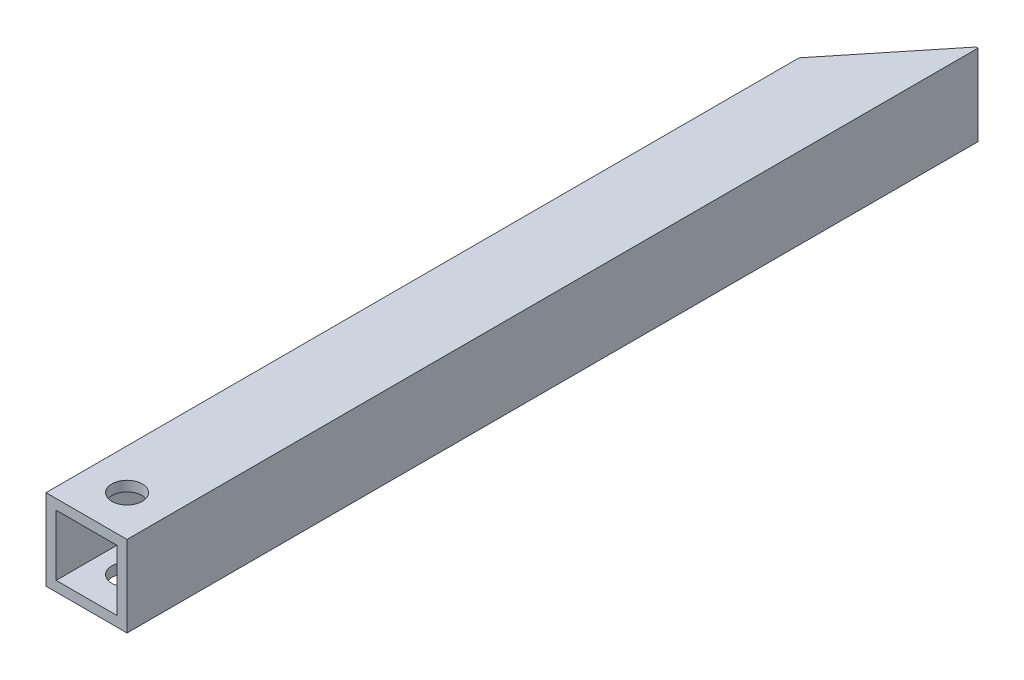
ISO-10303-21;
HEADER;
FILE_DESCRIPTION(('STEP AP214'),'2;1');
FILE_NAME('part.step','',(''),(''),'','','');
FILE_SCHEMA(('AUTOMOTIVE_DESIGN { 1 0 10303 214 1 1 1 1 }'));
ENDSEC;
DATA;
#1=APPLICATION_CONTEXT('core data for automotive mechanical design processes');
#2=APPLICATION_PROTOCOL_DEFINITION('international standard','automotive_design',2000,#1);
#3=PRODUCT_CONTEXT('',#1,'mechanical');
#4=PRODUCT('Part','Part','',(#3));
#5=PRODUCT_RELATED_PRODUCT_CATEGORY('part','',(#4));
#6=PRODUCT_DEFINITION_FORMATION('','',#4);
#7=PRODUCT_DEFINITION_CONTEXT('part definition',#1,'design');
#8=PRODUCT_DEFINITION('design','',#6,#7);
#9=PRODUCT_DEFINITION_SHAPE('','',#8);
#10=(LENGTH_UNIT() NAMED_UNIT(*) SI_UNIT(.MILLI.,.METRE.));
#11=(NAMED_UNIT(*) PLANE_ANGLE_UNIT() SI_UNIT($,.RADIAN.));
#12=(NAMED_UNIT(*) SI_UNIT($,.STERADIAN.) SOLID_ANGLE_UNIT());
#13=UNCERTAINTY_MEASURE_WITH_UNIT(LENGTH_MEASURE(1.E-05),#10,'distance_accuracy_value','');
#14=(GEOMETRIC_REPRESENTATION_CONTEXT(3) GLOBAL_UNCERTAINTY_ASSIGNED_CONTEXT((#13)) GLOBAL_UNIT_ASSIGNED_CONTEXT((#10,
#11,#12)) REPRESENTATION_CONTEXT('',''));
#15=CARTESIAN_POINT('',(0.,0.,0.));
#16=DIRECTION('',(0.,0.,1.));
#17=DIRECTION('',(1.,0.,0.));
#18=AXIS2_PLACEMENT_3D('',#15,#16,#17);
#19=CARTESIAN_POINT('',(0.,0.,266.7));
#20=DIRECTION('',(0.,0.,-1.));
#21=DIRECTION('',(-1.,0.,0.));
#22=AXIS2_PLACEMENT_3D('',#19,#20,#21);
#23=PLANE('',#22);
#24=DIRECTION('',(0.,-1.,0.));
#25=VECTOR('',#24,1.);
#26=CARTESIAN_POINT('',(0.,0.,266.7));
#27=LINE('',#26,#25);
#28=CARTESIAN_POINT('',(0.,25.4,266.7));
#29=VERTEX_POINT('',#28);
#30=CARTESIAN_POINT('',(0.,0.,266.7));
#31=VERTEX_POINT('',#30);
#32=EDGE_CURVE('E154',#29,#31,#27,.T.);
#33=ORIENTED_EDGE('',*,*,#32,.T.);
#34=DIRECTION('',(1.,0.,0.));
#35=VECTOR('',#34,1.);
#36=CARTESIAN_POINT('',(0.,0.,266.7));
#37=LINE('',#36,#35);
#38=CARTESIAN_POINT('',(25.4,0.,266.7));
#39=VERTEX_POINT('',#38);
#40=EDGE_CURVE('E161',#31,#39,#37,.T.);
#41=ORIENTED_EDGE('',*,*,#40,.T.);
#42=DIRECTION('',(0.,1.,0.));
#43=VECTOR('',#42,1.);
#44=CARTESIAN_POINT('',(25.4,0.,266.7));
#45=LINE('',#44,#43);
#46=CARTESIAN_POINT('',(25.4,25.4,266.7));
#47=VERTEX_POINT('',#46);
#48=EDGE_CURVE('E223',#39,#47,#45,.T.);
#49=ORIENTED_EDGE('',*,*,#48,.T.);
#50=DIRECTION('',(-1.,0.,0.));
#51=VECTOR('',#50,1.);
#52=CARTESIAN_POINT('',(0.,25.4,266.7));
#53=LINE('',#52,#51);
#54=EDGE_CURVE('E170',#47,#29,#53,.T.);
#55=ORIENTED_EDGE('',*,*,#54,.T.);
#56=EDGE_LOOP('',(#33,#41,#49,#55));
#57=FACE_BOUND('',#56,.T.);
#58=DIRECTION('',(0.,-1.,0.));
#59=VECTOR('',#58,1.);
#60=CARTESIAN_POINT('',(3.175,3.175,266.7));
#61=LINE('',#60,#59);
#62=CARTESIAN_POINT('',(3.175,22.225,266.7));
#63=VERTEX_POINT('',#62);
#64=CARTESIAN_POINT('',(3.175,3.175,266.7));
#65=VERTEX_POINT('',#64);
#66=EDGE_CURVE('E146',#63,#65,#61,.T.);
#67=ORIENTED_EDGE('',*,*,#66,.F.);
#68=DIRECTION('',(-1.,0.,0.));
#69=VECTOR('',#68,1.);
#70=CARTESIAN_POINT('',(3.175,22.225,266.7));
#71=LINE('',#70,#69);
#72=CARTESIAN_POINT('',(22.225,22.225,266.7));
#73=VERTEX_POINT('',#72);
#74=EDGE_CURVE('E203',#73,#63,#71,.T.);
#75=ORIENTED_EDGE('',*,*,#74,.F.);
#76=DIRECTION('',(0.,1.,0.));
#77=VECTOR('',#76,1.);
#78=CARTESIAN_POINT('',(22.225,3.175,266.7));
#79=LINE('',#78,#77);
#80=CARTESIAN_POINT('',(22.225,3.175,266.7));
#81=VERTEX_POINT('',#80);
#82=EDGE_CURVE('E199',#81,#73,#79,.T.);
#83=ORIENTED_EDGE('',*,*,#82,.F.);
#84=DIRECTION('',(1.,0.,0.));
#85=VECTOR('',#84,1.);
#86=CARTESIAN_POINT('',(3.175,3.175,266.7));
#87=LINE('',#86,#85);
#88=EDGE_CURVE('E196',#65,#81,#87,.T.);
#89=ORIENTED_EDGE('',*,*,#88,.F.);
#90=EDGE_LOOP('',(#67,#75,#83,#89));
#91=FACE_BOUND('',#90,.T.);
#92=ADVANCED_FACE('F38',(#57,#91),#23,.F.);
#93=CARTESIAN_POINT('',(0.,0.,0.));
#94=DIRECTION('',(0.,0.,-1.));
#95=DIRECTION('',(-1.,0.,0.));
#96=AXIS2_PLACEMENT_3D('',#93,#94,#95);
#97=PLANE('',#96);
#98=DIRECTION('',(0.,-1.,0.));
#99=VECTOR('',#98,1.);
#100=CARTESIAN_POINT('',(24.7814183655061,0.,0.));
#101=LINE('',#100,#99);
#102=CARTESIAN_POINT('',(24.7814183655061,25.4,0.));
#103=VERTEX_POINT('',#102);
#104=CARTESIAN_POINT('',(24.7814183655061,0.,0.));
#105=VERTEX_POINT('',#104);
#106=EDGE_CURVE('E128',#103,#105,#101,.T.);
#107=ORIENTED_EDGE('',*,*,#106,.F.);
#108=DIRECTION('',(-1.,0.,0.));
#109=VECTOR('',#108,1.);
#110=CARTESIAN_POINT('',(0.,25.4,0.));
#111=LINE('',#110,#109);
#112=CARTESIAN_POINT('',(25.4,25.4,0.));
#113=VERTEX_POINT('',#112);
#114=EDGE_CURVE('E143',#113,#103,#111,.T.);
#115=ORIENTED_EDGE('',*,*,#114,.F.);
#116=DIRECTION('',(0.,1.,0.));
#117=VECTOR('',#116,1.);
#118=CARTESIAN_POINT('',(25.4,0.,0.));
#119=LINE('',#118,#117);
#120=CARTESIAN_POINT('',(25.4,0.,0.));
#121=VERTEX_POINT('',#120);
#122=EDGE_CURVE('E155',#121,#113,#119,.T.);
#123=ORIENTED_EDGE('',*,*,#122,.F.);
#124=DIRECTION('',(1.,0.,0.));
#125=VECTOR('',#124,1.);
#126=CARTESIAN_POINT('',(0.,0.,0.));
#127=LINE('',#126,#125);
#128=EDGE_CURVE('E144',#105,#121,#127,.T.);
#129=ORIENTED_EDGE('',*,*,#128,.F.);
#130=EDGE_LOOP('',(#107,#115,#123,#129));
#131=FACE_BOUND('',#130,.T.);
#132=ADVANCED_FACE('F141',(#131),#97,.T.);
#133=CARTESIAN_POINT('',(0.,0.,266.7));
#134=DIRECTION('',(1.,0.,0.));
#135=DIRECTION('',(0.,0.,-1.));
#136=AXIS2_PLACEMENT_3D('',#133,#134,#135);
#137=PLANE('',#136);
#138=DIRECTION('',(0.,0.,-1.));
#139=VECTOR('',#138,1.);
#140=CARTESIAN_POINT('',(0.,25.4,266.7));
#141=LINE('',#140,#139);
#142=CARTESIAN_POINT('',(0.,25.4,30.6630296296406));
#143=VERTEX_POINT('',#142);
#144=EDGE_CURVE('E167',#29,#143,#141,.T.);
#145=ORIENTED_EDGE('',*,*,#144,.T.);
#146=DIRECTION('',(0.,-1.,0.));
#147=VECTOR('',#146,1.);
#148=CARTESIAN_POINT('',(0.,0.,30.6630296296407));
#149=LINE('',#148,#147);
#150=CARTESIAN_POINT('',(0.,0.,30.6630296296407));
#151=VERTEX_POINT('',#150);
#152=EDGE_CURVE('E58',#143,#151,#149,.T.);
#153=ORIENTED_EDGE('',*,*,#152,.T.);
#154=DIRECTION('',(0.,0.,-1.));
#155=VECTOR('',#154,1.);
#156=CARTESIAN_POINT('',(0.,0.,266.7));
#157=LINE('',#156,#155);
#158=EDGE_CURVE('E48',#31,#151,#157,.T.);
#159=ORIENTED_EDGE('',*,*,#158,.F.);
#160=ORIENTED_EDGE('',*,*,#32,.F.);
#161=EDGE_LOOP('',(#145,#153,#159,#160));
#162=FACE_BOUND('',#161,.T.);
#163=ADVANCED_FACE('F40',(#162),#137,.F.);
#164=CARTESIAN_POINT('',(0.,0.,266.7));
#165=DIRECTION('',(0.,1.,0.));
#166=DIRECTION('',(0.,0.,1.));
#167=AXIS2_PLACEMENT_3D('',#164,#165,#166);
#168=PLANE('',#167);
#169=CARTESIAN_POINT('',(12.7,0.,254.));
#170=DIRECTION('',(0.,1.,0.));
#171=DIRECTION('',(0.,0.,1.));
#172=AXIS2_PLACEMENT_3D('',#169,#170,#171);
#173=CIRCLE('',#172,4.7625);
#174=CARTESIAN_POINT('',(12.7,0.,258.7625));
#175=VERTEX_POINT('',#174);
#176=EDGE_CURVE('E259',#175,#175,#173,.T.);
#177=ORIENTED_EDGE('',*,*,#176,.T.);
#178=EDGE_LOOP('',(#177));
#179=FACE_BOUND('',#178,.T.);
#180=ORIENTED_EDGE('',*,*,#158,.T.);
#181=DIRECTION('',(0.628569257450361,0.,-0.777753616891816));
#182=VECTOR('',#181,1.);
#183=CARTESIAN_POINT('',(28.21862747353,0.,-4.2529948515502));
#184=LINE('',#183,#182);
#185=EDGE_CURVE('E135',#151,#105,#184,.T.);
#186=ORIENTED_EDGE('',*,*,#185,.T.);
#187=ORIENTED_EDGE('',*,*,#128,.T.);
#188=DIRECTION('',(0.,0.,-1.));
#189=VECTOR('',#188,1.);
#190=CARTESIAN_POINT('',(25.4,0.,266.7));
#191=LINE('',#190,#189);
#192=EDGE_CURVE('E173',#39,#121,#191,.T.);
#193=ORIENTED_EDGE('',*,*,#192,.F.);
#194=ORIENTED_EDGE('',*,*,#40,.F.);
#195=EDGE_LOOP('',(#180,#186,#187,#193,#194));
#196=FACE_BOUND('',#195,.T.);
#197=ADVANCED_FACE('F182',(#179,#196),#168,.F.);
#198=CARTESIAN_POINT('',(25.4,0.,266.7));
#199=DIRECTION('',(-1.,0.,0.));
#200=DIRECTION('',(0.,0.,1.));
#201=AXIS2_PLACEMENT_3D('',#198,#199,#200);
#202=PLANE('',#201);
#203=ORIENTED_EDGE('',*,*,#122,.T.);
#204=DIRECTION('',(0.,0.,-1.));
#205=VECTOR('',#204,1.);
#206=CARTESIAN_POINT('',(25.4,25.4,266.7));
#207=LINE('',#206,#205);
#208=EDGE_CURVE('E152',#47,#113,#207,.T.);
#209=ORIENTED_EDGE('',*,*,#208,.F.);
#210=ORIENTED_EDGE('',*,*,#48,.F.);
#211=ORIENTED_EDGE('',*,*,#192,.T.);
#212=EDGE_LOOP('',(#203,#209,#210,#211));
#213=FACE_BOUND('',#212,.T.);
#214=ADVANCED_FACE('F230',(#213),#202,.F.);
#215=CARTESIAN_POINT('',(0.,25.4,266.7));
#216=DIRECTION('',(0.,-1.,0.));
#217=DIRECTION('',(0.,0.,-1.));
#218=AXIS2_PLACEMENT_3D('',#215,#216,#217);
#219=PLANE('',#218);
#220=CARTESIAN_POINT('',(12.7,25.4,254.));
#221=DIRECTION('',(0.,1.,0.));
#222=DIRECTION('',(0.,0.,1.));
#223=AXIS2_PLACEMENT_3D('',#220,#221,#222);
#224=CIRCLE('',#223,4.7625);
#225=CARTESIAN_POINT('',(12.7,25.4,258.7625));
#226=VERTEX_POINT('',#225);
#227=EDGE_CURVE('E255',#226,#226,#224,.T.);
#228=ORIENTED_EDGE('',*,*,#227,.F.);
#229=EDGE_LOOP('',(#228));
#230=FACE_BOUND('',#229,.T.);
#231=ORIENTED_EDGE('',*,*,#114,.T.);
#232=DIRECTION('',(0.628569257450361,0.,-0.777753616891816));
#233=VECTOR('',#232,1.);
#234=CARTESIAN_POINT('',(28.21862747353,25.4,-4.2529948515502));
#235=LINE('',#234,#233);
#236=EDGE_CURVE('E125',#143,#103,#235,.T.);
#237=ORIENTED_EDGE('',*,*,#236,.F.);
#238=ORIENTED_EDGE('',*,*,#144,.F.);
#239=ORIENTED_EDGE('',*,*,#54,.F.);
#240=ORIENTED_EDGE('',*,*,#208,.T.);
#241=EDGE_LOOP('',(#231,#237,#238,#239,#240));
#242=FACE_BOUND('',#241,.T.);
#243=ADVANCED_FACE('F149',(#230,#242),#219,.F.);
#244=CARTESIAN_POINT('',(3.175,3.175,266.7));
#245=DIRECTION('',(1.,0.,0.));
#246=DIRECTION('',(0.,0.,-1.));
#247=AXIS2_PLACEMENT_3D('',#244,#245,#246);
#248=PLANE('',#247);
#249=DIRECTION('',(0.,-1.,0.));
#250=VECTOR('',#249,1.);
#251=CARTESIAN_POINT('',(3.175,3.175,26.7344764839652));
#252=LINE('',#251,#250);
#253=CARTESIAN_POINT('',(3.17500000000001,22.225,26.7344764839652));
#254=VERTEX_POINT('',#253);
#255=CARTESIAN_POINT('',(3.17500000000001,3.175,26.7344764839652));
#256=VERTEX_POINT('',#255);
#257=EDGE_CURVE('E187',#254,#256,#252,.T.);
#258=ORIENTED_EDGE('',*,*,#257,.F.);
#259=DIRECTION('',(0.,0.,-1.));
#260=VECTOR('',#259,1.);
#261=CARTESIAN_POINT('',(3.175,22.225,266.7));
#262=LINE('',#261,#260);
#263=EDGE_CURVE('E206',#63,#254,#262,.T.);
#264=ORIENTED_EDGE('',*,*,#263,.F.);
#265=ORIENTED_EDGE('',*,*,#66,.T.);
#266=DIRECTION('',(0.,0.,-1.));
#267=VECTOR('',#266,1.);
#268=CARTESIAN_POINT('',(3.175,3.175,266.7));
#269=LINE('',#268,#267);
#270=EDGE_CURVE('E218',#65,#256,#269,.T.);
#271=ORIENTED_EDGE('',*,*,#270,.T.);
#272=EDGE_LOOP('',(#258,#264,#265,#271));
#273=FACE_BOUND('',#272,.T.);
#274=ADVANCED_FACE('F243',(#273),#248,.T.);
#275=CARTESIAN_POINT('',(3.175,3.175,266.7));
#276=DIRECTION('',(0.,1.,0.));
#277=DIRECTION('',(0.,0.,1.));
#278=AXIS2_PLACEMENT_3D('',#275,#276,#277);
#279=PLANE('',#278);
#280=CARTESIAN_POINT('',(12.7,3.175,254.));
#281=DIRECTION('',(0.,1.,0.));
#282=DIRECTION('',(0.,0.,1.));
#283=AXIS2_PLACEMENT_3D('',#280,#281,#282);
#284=CIRCLE('',#283,4.7625);
#285=CARTESIAN_POINT('',(12.7,3.175,258.7625));
#286=VERTEX_POINT('',#285);
#287=EDGE_CURVE('E136',#286,#286,#284,.T.);
#288=ORIENTED_EDGE('',*,*,#287,.F.);
#289=EDGE_LOOP('',(#288));
#290=FACE_BOUND('',#289,.T.);
#291=DIRECTION('',(0.628569257450361,0.,-0.777753616891816));
#292=VECTOR('',#291,1.);
#293=CARTESIAN_POINT('',(-114.137428639632,3.175,171.889786896267));
#294=LINE('',#293,#292);
#295=CARTESIAN_POINT('',(22.225,3.175,3.16315760991231));
#296=VERTEX_POINT('',#295);
#297=EDGE_CURVE('E190',#256,#296,#294,.T.);
#298=ORIENTED_EDGE('',*,*,#297,.F.);
#299=ORIENTED_EDGE('',*,*,#270,.F.);
#300=ORIENTED_EDGE('',*,*,#88,.T.);
#301=DIRECTION('',(0.,0.,-1.));
#302=VECTOR('',#301,1.);
#303=CARTESIAN_POINT('',(22.225,3.175,266.7));
#304=LINE('',#303,#302);
#305=EDGE_CURVE('E214',#81,#296,#304,.T.);
#306=ORIENTED_EDGE('',*,*,#305,.T.);
#307=EDGE_LOOP('',(#298,#299,#300,#306));
#308=FACE_BOUND('',#307,.T.);
#309=ADVANCED_FACE('F246',(#290,#308),#279,.T.);
#310=CARTESIAN_POINT('',(22.225,3.175,266.7));
#311=DIRECTION('',(-1.,0.,0.));
#312=DIRECTION('',(0.,0.,1.));
#313=AXIS2_PLACEMENT_3D('',#310,#311,#312);
#314=PLANE('',#313);
#315=DIRECTION('',(0.,1.,0.));
#316=VECTOR('',#315,1.);
#317=CARTESIAN_POINT('',(22.225,3.175,3.16315760991231));
#318=LINE('',#317,#316);
#319=CARTESIAN_POINT('',(22.225,22.225,3.16315760991223));
#320=VERTEX_POINT('',#319);
#321=EDGE_CURVE('E68',#296,#320,#318,.T.);
#322=ORIENTED_EDGE('',*,*,#321,.F.);
#323=ORIENTED_EDGE('',*,*,#305,.F.);
#324=ORIENTED_EDGE('',*,*,#82,.T.);
#325=DIRECTION('',(0.,0.,-1.));
#326=VECTOR('',#325,1.);
#327=CARTESIAN_POINT('',(22.225,22.225,266.7));
#328=LINE('',#327,#326);
#329=EDGE_CURVE('E210',#73,#320,#328,.T.);
#330=ORIENTED_EDGE('',*,*,#329,.T.);
#331=EDGE_LOOP('',(#322,#323,#324,#330));
#332=FACE_BOUND('',#331,.T.);
#333=ADVANCED_FACE('F274',(#332),#314,.T.);
#334=CARTESIAN_POINT('',(3.175,22.225,266.7));
#335=DIRECTION('',(0.,-1.,0.));
#336=DIRECTION('',(0.,0.,-1.));
#337=AXIS2_PLACEMENT_3D('',#334,#335,#336);
#338=PLANE('',#337);
#339=CARTESIAN_POINT('',(12.7,22.225,254.));
#340=DIRECTION('',(0.,-1.,0.));
#341=DIRECTION('',(0.,0.,-1.));
#342=AXIS2_PLACEMENT_3D('',#339,#340,#341);
#343=CIRCLE('',#342,4.7625);
#344=CARTESIAN_POINT('',(12.7,22.225,249.2375));
#345=VERTEX_POINT('',#344);
#346=EDGE_CURVE('E42',#345,#345,#343,.T.);
#347=ORIENTED_EDGE('',*,*,#346,.F.);
#348=EDGE_LOOP('',(#347));
#349=FACE_BOUND('',#348,.T.);
#350=DIRECTION('',(-0.628569257450361,0.,0.777753616891816));
#351=VECTOR('',#350,1.);
#352=CARTESIAN_POINT('',(-114.137428639632,22.225,171.889786896267));
#353=LINE('',#352,#351);
#354=EDGE_CURVE('E11',#320,#254,#353,.T.);
#355=ORIENTED_EDGE('',*,*,#354,.F.);
#356=ORIENTED_EDGE('',*,*,#329,.F.);
#357=ORIENTED_EDGE('',*,*,#74,.T.);
#358=ORIENTED_EDGE('',*,*,#263,.T.);
#359=EDGE_LOOP('',(#355,#356,#357,#358));
#360=FACE_BOUND('',#359,.T.);
#361=ADVANCED_FACE('F271',(#349,#360),#338,.T.);
#362=CARTESIAN_POINT('',(28.21862747353,0.,-4.2529948515502));
#363=DIRECTION('',(0.777753616891816,0.,0.628569257450361));
#364=DIRECTION('',(0.628569257450361,0.,-0.777753616891816));
#365=AXIS2_PLACEMENT_3D('',#362,#363,#364);
#366=PLANE('',#365);
#367=ORIENTED_EDGE('',*,*,#106,.T.);
#368=ORIENTED_EDGE('',*,*,#185,.F.);
#369=ORIENTED_EDGE('',*,*,#152,.F.);
#370=ORIENTED_EDGE('',*,*,#236,.T.);
#371=EDGE_LOOP('',(#367,#368,#369,#370));
#372=FACE_BOUND('',#371,.T.);
#373=ORIENTED_EDGE('',*,*,#257,.T.);
#374=ORIENTED_EDGE('',*,*,#297,.T.);
#375=ORIENTED_EDGE('',*,*,#321,.T.);
#376=ORIENTED_EDGE('',*,*,#354,.T.);
#377=EDGE_LOOP('',(#373,#374,#375,#376));
#378=FACE_BOUND('',#377,.T.);
#379=ADVANCED_FACE('F127',(#372,#378),#366,.F.);
#380=CARTESIAN_POINT('',(12.7,0.,254.));
#381=DIRECTION('',(0.,1.,0.));
#382=DIRECTION('',(0.,0.,1.));
#383=AXIS2_PLACEMENT_3D('',#380,#381,#382);
#384=CYLINDRICAL_SURFACE('',#383,4.7625);
#385=ORIENTED_EDGE('',*,*,#346,.T.);
#386=EDGE_LOOP('',(#385));
#387=FACE_BOUND('',#386,.T.);
#388=ORIENTED_EDGE('',*,*,#227,.T.);
#389=EDGE_LOOP('',(#388));
#390=FACE_BOUND('',#389,.T.);
#391=ADVANCED_FACE('F268',(#387,#390),#384,.F.);
#392=ORIENTED_EDGE('',*,*,#287,.T.);
#393=EDGE_LOOP('',(#392));
#394=FACE_BOUND('',#393,.T.);
#395=ORIENTED_EDGE('',*,*,#176,.F.);
#396=EDGE_LOOP('',(#395));
#397=FACE_BOUND('',#396,.T.);
#398=ADVANCED_FACE('F344',(#394,#397),#384,.F.);
#399=CLOSED_SHELL('',(#92,#132,#163,#197,#214,#243,#274,#309,#333,#361,#379,#391,#398));
#400=MANIFOLD_SOLID_BREP('B2',#399);
#401=ADVANCED_BREP_SHAPE_REPRESENTATION('',(#18,#400),#14);
#402=SHAPE_DEFINITION_REPRESENTATION(#9,#401);
ENDSEC;
END-ISO-10303-21;
